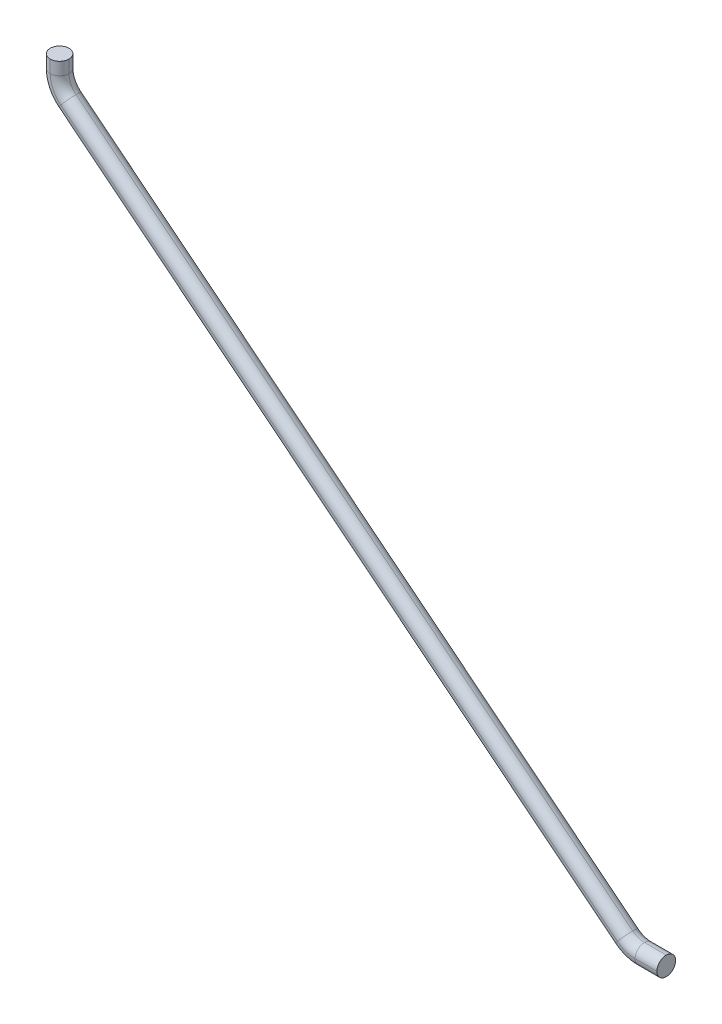
ISO-10303-21;
HEADER;
FILE_DESCRIPTION(('STEP AP214'),'2;1');
FILE_NAME('part.step','',(''),(''),'','','');
FILE_SCHEMA(('AUTOMOTIVE_DESIGN { 1 0 10303 214 1 1 1 1 }'));
ENDSEC;
DATA;
#1=APPLICATION_CONTEXT('core data for automotive mechanical design processes');
#2=APPLICATION_PROTOCOL_DEFINITION('international standard','automotive_design',2000,#1);
#3=PRODUCT_CONTEXT('',#1,'mechanical');
#4=PRODUCT('Part','Part','',(#3));
#5=PRODUCT_RELATED_PRODUCT_CATEGORY('part','',(#4));
#6=PRODUCT_DEFINITION_FORMATION('','',#4);
#7=PRODUCT_DEFINITION_CONTEXT('part definition',#1,'design');
#8=PRODUCT_DEFINITION('design','',#6,#7);
#9=PRODUCT_DEFINITION_SHAPE('','',#8);
#10=(LENGTH_UNIT() NAMED_UNIT(*) SI_UNIT(.MILLI.,.METRE.));
#11=(NAMED_UNIT(*) PLANE_ANGLE_UNIT() SI_UNIT($,.RADIAN.));
#12=(NAMED_UNIT(*) SI_UNIT($,.STERADIAN.) SOLID_ANGLE_UNIT());
#13=UNCERTAINTY_MEASURE_WITH_UNIT(LENGTH_MEASURE(1.E-05),#10,'distance_accuracy_value','');
#14=(GEOMETRIC_REPRESENTATION_CONTEXT(3) GLOBAL_UNCERTAINTY_ASSIGNED_CONTEXT((#13)) GLOBAL_UNIT_ASSIGNED_CONTEXT((#10,
#11,#12)) REPRESENTATION_CONTEXT('',''));
#15=CARTESIAN_POINT('',(0.,0.,0.));
#16=DIRECTION('',(0.,0.,1.));
#17=DIRECTION('',(1.,0.,0.));
#18=AXIS2_PLACEMENT_3D('',#15,#16,#17);
#19=CARTESIAN_POINT('',(-398.535967460034,-990.945694684209,-10.));
#20=DIRECTION('',(0.,1.,0.));
#21=DIRECTION('',(0.,0.,1.));
#22=AXIS2_PLACEMENT_3D('',#19,#20,#21);
#23=PLANE('',#22);
#24=CARTESIAN_POINT('',(-408.535967460034,-990.945694684209,0.));
#25=DIRECTION('',(0.,1.,0.));
#26=DIRECTION('',(0.,0.,1.));
#27=AXIS2_PLACEMENT_3D('',#24,#25,#26);
#28=CIRCLE('',#27,10.);
#29=CARTESIAN_POINT('',(-408.535967460034,-990.945694684209,10.));
#30=VERTEX_POINT('',#29);
#31=CARTESIAN_POINT('',(-398.535967460034,-990.945694684209,0.));
#32=VERTEX_POINT('',#31);
#33=EDGE_CURVE('E136',#30,#32,#28,.T.);
#34=ORIENTED_EDGE('',*,*,#33,.T.);
#35=CARTESIAN_POINT('',(-408.535967460034,-990.945694684209,0.));
#36=DIRECTION('',(0.,1.,0.));
#37=DIRECTION('',(0.,0.,1.));
#38=AXIS2_PLACEMENT_3D('',#35,#36,#37);
#39=CIRCLE('',#38,10.);
#40=CARTESIAN_POINT('',(-408.535967460034,-990.945694684209,-10.));
#41=VERTEX_POINT('',#40);
#42=EDGE_CURVE('E11',#32,#41,#39,.T.);
#43=ORIENTED_EDGE('',*,*,#42,.T.);
#44=CARTESIAN_POINT('',(-408.535967460034,-990.945694684209,0.));
#45=DIRECTION('',(0.,1.,0.));
#46=DIRECTION('',(0.,0.,1.));
#47=AXIS2_PLACEMENT_3D('',#44,#45,#46);
#48=CIRCLE('',#47,10.);
#49=CARTESIAN_POINT('',(-418.535967460034,-990.945694684209,0.));
#50=VERTEX_POINT('',#49);
#51=EDGE_CURVE('E44',#41,#50,#48,.T.);
#52=ORIENTED_EDGE('',*,*,#51,.T.);
#53=CARTESIAN_POINT('',(-408.535967460034,-990.945694684209,0.));
#54=DIRECTION('',(0.,1.,0.));
#55=DIRECTION('',(0.,0.,1.));
#56=AXIS2_PLACEMENT_3D('',#53,#54,#55);
#57=CIRCLE('',#56,10.);
#58=EDGE_CURVE('E135',#50,#30,#57,.T.);
#59=ORIENTED_EDGE('',*,*,#58,.T.);
#60=EDGE_LOOP('',(#34,#43,#52,#59));
#61=FACE_BOUND('',#60,.T.);
#62=ADVANCED_FACE('F34',(#61),#23,.T.);
#63=CARTESIAN_POINT('',(237.926881338432,-1499.57063721451,-10.));
#64=DIRECTION('',(1.,0.,0.));
#65=DIRECTION('',(0.,0.,-1.));
#66=AXIS2_PLACEMENT_3D('',#63,#64,#65);
#67=PLANE('',#66);
#68=CARTESIAN_POINT('',(237.926881338432,-1509.57063721451,0.));
#69=DIRECTION('',(1.,0.,0.));
#70=DIRECTION('',(0.,0.,-1.));
#71=AXIS2_PLACEMENT_3D('',#68,#69,#70);
#72=CIRCLE('',#71,10.);
#73=CARTESIAN_POINT('',(237.926881338432,-1519.57063721451,0.));
#74=VERTEX_POINT('',#73);
#75=CARTESIAN_POINT('',(237.926881338432,-1509.57063721451,-10.));
#76=VERTEX_POINT('',#75);
#77=EDGE_CURVE('E470',#74,#76,#72,.T.);
#78=ORIENTED_EDGE('',*,*,#77,.T.);
#79=CARTESIAN_POINT('',(237.926881338432,-1509.57063721451,0.));
#80=DIRECTION('',(1.,0.,0.));
#81=DIRECTION('',(0.,0.,-1.));
#82=AXIS2_PLACEMENT_3D('',#79,#80,#81);
#83=CIRCLE('',#82,10.);
#84=CARTESIAN_POINT('',(237.926881338432,-1499.57063721451,0.));
#85=VERTEX_POINT('',#84);
#86=EDGE_CURVE('E138',#76,#85,#83,.T.);
#87=ORIENTED_EDGE('',*,*,#86,.T.);
#88=CARTESIAN_POINT('',(237.926881338432,-1509.57063721451,0.));
#89=DIRECTION('',(1.,0.,0.));
#90=DIRECTION('',(0.,0.,-1.));
#91=AXIS2_PLACEMENT_3D('',#88,#89,#90);
#92=CIRCLE('',#91,10.);
#93=CARTESIAN_POINT('',(237.926881338432,-1509.57063721451,10.));
#94=VERTEX_POINT('',#93);
#95=EDGE_CURVE('E473',#85,#94,#92,.T.);
#96=ORIENTED_EDGE('',*,*,#95,.T.);
#97=CARTESIAN_POINT('',(237.926881338432,-1509.57063721451,0.));
#98=DIRECTION('',(1.,0.,0.));
#99=DIRECTION('',(0.,0.,-1.));
#100=AXIS2_PLACEMENT_3D('',#97,#98,#99);
#101=CIRCLE('',#100,10.);
#102=EDGE_CURVE('E142',#94,#74,#101,.T.);
#103=ORIENTED_EDGE('',*,*,#102,.T.);
#104=EDGE_LOOP('',(#78,#87,#96,#103));
#105=FACE_BOUND('',#104,.T.);
#106=ADVANCED_FACE('F271',(#105),#67,.T.);
#107=CARTESIAN_POINT('',(-408.535967460034,-1004.3738482205,0.));
#108=DIRECTION('',(0.,1.,0.));
#109=DIRECTION('',(0.,0.,1.));
#110=AXIS2_PLACEMENT_3D('',#107,#108,#109);
#111=CYLINDRICAL_SURFACE('',#110,10.);
#112=DIRECTION('',(0.,-1.,0.));
#113=VECTOR('',#112,1.);
#114=CARTESIAN_POINT('',(-408.535967460034,-1004.3738482205,10.));
#115=LINE('',#114,#113);
#116=CARTESIAN_POINT('',(-408.535967460034,-1004.3738482205,10.));
#117=VERTEX_POINT('',#116);
#118=EDGE_CURVE('E38',#30,#117,#115,.T.);
#119=ORIENTED_EDGE('',*,*,#118,.F.);
#120=ORIENTED_EDGE('',*,*,#58,.F.);
#121=DIRECTION('',(0.,-1.,0.));
#122=VECTOR('',#121,1.);
#123=CARTESIAN_POINT('',(-418.535967460034,-990.945694684209,0.));
#124=LINE('',#123,#122);
#125=CARTESIAN_POINT('',(-418.535967460034,-1004.3738482205,0.));
#126=VERTEX_POINT('',#125);
#127=EDGE_CURVE('E106',#126,#50,#124,.F.);
#128=ORIENTED_EDGE('',*,*,#127,.F.);
#129=CARTESIAN_POINT('',(-408.535967460034,-1004.3738482205,0.));
#130=DIRECTION('',(0.,-1.,0.));
#131=DIRECTION('',(0.,0.,-1.));
#132=AXIS2_PLACEMENT_3D('',#129,#130,#131);
#133=CIRCLE('',#132,10.);
#134=EDGE_CURVE('E140',#117,#126,#133,.T.);
#135=ORIENTED_EDGE('',*,*,#134,.F.);
#136=EDGE_LOOP('',(#119,#120,#128,#135));
#137=FACE_BOUND('',#136,.T.);
#138=ADVANCED_FACE('F36',(#137),#111,.T.);
#139=CARTESIAN_POINT('',(-408.535967460034,-1004.3738482205,0.));
#140=DIRECTION('',(0.,-1.,0.));
#141=DIRECTION('',(0.,0.,-1.));
#142=AXIS2_PLACEMENT_3D('',#139,#140,#141);
#143=CYLINDRICAL_SURFACE('',#142,10.);
#144=ORIENTED_EDGE('',*,*,#33,.F.);
#145=ORIENTED_EDGE('',*,*,#118,.T.);
#146=CARTESIAN_POINT('',(-408.535967460034,-1004.3738482205,0.));
#147=DIRECTION('',(0.,-1.,0.));
#148=DIRECTION('',(0.,0.,-1.));
#149=AXIS2_PLACEMENT_3D('',#146,#147,#148);
#150=CIRCLE('',#149,10.);
#151=CARTESIAN_POINT('',(-398.535967460034,-1004.3738482205,0.));
#152=VERTEX_POINT('',#151);
#153=EDGE_CURVE('E233',#152,#117,#150,.T.);
#154=ORIENTED_EDGE('',*,*,#153,.F.);
#155=DIRECTION('',(0.,1.,0.));
#156=VECTOR('',#155,1.);
#157=CARTESIAN_POINT('',(-398.535967460034,-1004.3738482205,0.));
#158=LINE('',#157,#156);
#159=EDGE_CURVE('E145',#32,#152,#158,.F.);
#160=ORIENTED_EDGE('',*,*,#159,.F.);
#161=EDGE_LOOP('',(#144,#145,#154,#160));
#162=FACE_BOUND('',#161,.T.);
#163=ADVANCED_FACE('F143',(#162),#143,.T.);
#164=CARTESIAN_POINT('',(-408.535967460034,-990.945694684209,0.));
#165=DIRECTION('',(0.,-1.,0.));
#166=DIRECTION('',(0.,0.,-1.));
#167=AXIS2_PLACEMENT_3D('',#164,#165,#166);
#168=CYLINDRICAL_SURFACE('',#167,10.);
#169=ORIENTED_EDGE('',*,*,#127,.T.);
#170=ORIENTED_EDGE('',*,*,#51,.F.);
#171=DIRECTION('',(0.,-1.,0.));
#172=VECTOR('',#171,1.);
#173=CARTESIAN_POINT('',(-408.535967460034,-1004.3738482205,-10.));
#174=LINE('',#173,#172);
#175=CARTESIAN_POINT('',(-408.535967460034,-1004.3738482205,-10.));
#176=VERTEX_POINT('',#175);
#177=EDGE_CURVE('E53',#176,#41,#174,.F.);
#178=ORIENTED_EDGE('',*,*,#177,.F.);
#179=CARTESIAN_POINT('',(-408.535967460034,-1004.3738482205,0.));
#180=DIRECTION('',(0.,-1.,0.));
#181=DIRECTION('',(0.,0.,-1.));
#182=AXIS2_PLACEMENT_3D('',#179,#180,#181);
#183=CIRCLE('',#182,10.);
#184=EDGE_CURVE('E228',#126,#176,#183,.T.);
#185=ORIENTED_EDGE('',*,*,#184,.F.);
#186=EDGE_LOOP('',(#169,#170,#178,#185));
#187=FACE_BOUND('',#186,.T.);
#188=ADVANCED_FACE('F240',(#187),#168,.T.);
#189=CARTESIAN_POINT('',(-378.535967460034,-1004.3738482205,0.));
#190=DIRECTION('',(0.,0.,-1.));
#191=DIRECTION('',(-1.,0.,0.));
#192=AXIS2_PLACEMENT_3D('',#189,#190,#191);
#193=TOROIDAL_SURFACE('',#192,30.0000000000001,10.);
#194=CARTESIAN_POINT('',(-378.535967460034,-1004.3738482205,10.));
#195=DIRECTION('',(0.,0.,-1.));
#196=DIRECTION('',(-1.,0.,0.));
#197=AXIS2_PLACEMENT_3D('',#194,#195,#196);
#198=CIRCLE('',#197,30.0000000000001);
#199=CARTESIAN_POINT('',(-397.290955483856,-1027.78859622739,10.));
#200=VERTEX_POINT('',#199);
#201=EDGE_CURVE('E236',#117,#200,#198,.F.);
#202=ORIENTED_EDGE('',*,*,#201,.F.);
#203=ORIENTED_EDGE('',*,*,#134,.T.);
#204=CARTESIAN_POINT('',(-378.535967460034,-1004.3738482205,0.));
#205=DIRECTION('',(0.,0.,-1.));
#206=DIRECTION('',(-1.,0.,0.));
#207=AXIS2_PLACEMENT_3D('',#204,#205,#206);
#208=CIRCLE('',#207,40.0000000000001);
#209=CARTESIAN_POINT('',(-403.542618158463,-1035.59351222969,0.));
#210=VERTEX_POINT('',#209);
#211=EDGE_CURVE('E225',#210,#126,#208,.T.);
#212=ORIENTED_EDGE('',*,*,#211,.F.);
#213=CARTESIAN_POINT('',(-397.290955483856,-1027.78859622739,0.));
#214=DIRECTION('',(0.780491600229767,-0.625166267460727,0.));
#215=DIRECTION('',(0.625166267460727,0.780491600229767,0.));
#216=AXIS2_PLACEMENT_3D('',#213,#214,#215);
#217=CIRCLE('',#216,10.);
#218=EDGE_CURVE('E222',#200,#210,#217,.T.);
#219=ORIENTED_EDGE('',*,*,#218,.F.);
#220=EDGE_LOOP('',(#202,#203,#212,#219));
#221=FACE_BOUND('',#220,.T.);
#222=ADVANCED_FACE('F246',(#221),#193,.T.);
#223=CARTESIAN_POINT('',(-378.535967460034,-1004.3738482205,0.));
#224=DIRECTION('',(0.,0.,-1.));
#225=DIRECTION('',(-1.,0.,0.));
#226=AXIS2_PLACEMENT_3D('',#223,#224,#225);
#227=TOROIDAL_SURFACE('',#226,30.,10.);
#228=ORIENTED_EDGE('',*,*,#153,.T.);
#229=ORIENTED_EDGE('',*,*,#201,.T.);
#230=CARTESIAN_POINT('',(-397.290955483856,-1027.78859622739,0.));
#231=DIRECTION('',(0.780491600229764,-0.625166267460731,0.));
#232=DIRECTION('',(0.625166267460731,0.780491600229764,0.));
#233=AXIS2_PLACEMENT_3D('',#230,#231,#232);
#234=CIRCLE('',#233,10.);
#235=CARTESIAN_POINT('',(-391.039292809248,-1019.98368022509,0.));
#236=VERTEX_POINT('',#235);
#237=EDGE_CURVE('E217',#236,#200,#234,.T.);
#238=ORIENTED_EDGE('',*,*,#237,.F.);
#239=CARTESIAN_POINT('',(-378.535967460034,-1004.3738482205,0.));
#240=DIRECTION('',(0.,0.,-1.));
#241=DIRECTION('',(-1.,0.,0.));
#242=AXIS2_PLACEMENT_3D('',#239,#240,#241);
#243=CIRCLE('',#242,20.);
#244=EDGE_CURVE('E214',#152,#236,#243,.F.);
#245=ORIENTED_EDGE('',*,*,#244,.F.);
#246=EDGE_LOOP('',(#228,#229,#238,#245));
#247=FACE_BOUND('',#246,.T.);
#248=ADVANCED_FACE('F257',(#247),#227,.T.);
#249=CARTESIAN_POINT('',(-408.535967460034,-990.945694684209,0.));
#250=DIRECTION('',(0.,1.,0.));
#251=DIRECTION('',(0.,0.,1.));
#252=AXIS2_PLACEMENT_3D('',#249,#250,#251);
#253=CYLINDRICAL_SURFACE('',#252,10.);
#254=ORIENTED_EDGE('',*,*,#42,.F.);
#255=ORIENTED_EDGE('',*,*,#159,.T.);
#256=CARTESIAN_POINT('',(-408.535967460034,-1004.3738482205,0.));
#257=DIRECTION('',(0.,-1.,0.));
#258=DIRECTION('',(0.,0.,-1.));
#259=AXIS2_PLACEMENT_3D('',#256,#257,#258);
#260=CIRCLE('',#259,10.);
#261=EDGE_CURVE('E211',#176,#152,#260,.T.);
#262=ORIENTED_EDGE('',*,*,#261,.F.);
#263=ORIENTED_EDGE('',*,*,#177,.T.);
#264=EDGE_LOOP('',(#254,#255,#262,#263));
#265=FACE_BOUND('',#264,.T.);
#266=ADVANCED_FACE('F261',(#265),#253,.T.);
#267=CARTESIAN_POINT('',(-378.535967460034,-1004.3738482205,0.));
#268=DIRECTION('',(0.,0.,-1.));
#269=DIRECTION('',(-1.,0.,0.));
#270=AXIS2_PLACEMENT_3D('',#267,#268,#269);
#271=TOROIDAL_SURFACE('',#270,30.0000000000001,10.);
#272=ORIENTED_EDGE('',*,*,#211,.T.);
#273=ORIENTED_EDGE('',*,*,#184,.T.);
#274=CARTESIAN_POINT('',(-378.535967460034,-1004.3738482205,-10.));
#275=DIRECTION('',(0.,0.,-1.));
#276=DIRECTION('',(-1.,0.,0.));
#277=AXIS2_PLACEMENT_3D('',#274,#275,#276);
#278=CIRCLE('',#277,30.0000000000001);
#279=CARTESIAN_POINT('',(-397.290955483856,-1027.78859622739,-10.));
#280=VERTEX_POINT('',#279);
#281=EDGE_CURVE('E208',#280,#176,#278,.T.);
#282=ORIENTED_EDGE('',*,*,#281,.F.);
#283=CARTESIAN_POINT('',(-397.290955483856,-1027.78859622739,0.));
#284=DIRECTION('',(0.780491600229767,-0.625166267460727,0.));
#285=DIRECTION('',(0.625166267460727,0.780491600229767,0.));
#286=AXIS2_PLACEMENT_3D('',#283,#284,#285);
#287=CIRCLE('',#286,10.);
#288=EDGE_CURVE('E205',#210,#280,#287,.T.);
#289=ORIENTED_EDGE('',*,*,#288,.F.);
#290=EDGE_LOOP('',(#272,#273,#282,#289));
#291=FACE_BOUND('',#290,.T.);
#292=ADVANCED_FACE('F243',(#291),#271,.T.);
#293=CARTESIAN_POINT('',(-397.290955483856,-1027.78859622739,0.));
#294=DIRECTION('',(-0.780491600229761,0.625166267460735,0.));
#295=DIRECTION('',(-0.625166267460735,-0.780491600229761,0.));
#296=AXIS2_PLACEMENT_3D('',#293,#294,#295);
#297=CYLINDRICAL_SURFACE('',#296,10.);
#298=DIRECTION('',(0.780491600229761,-0.625166267460735,0.));
#299=VECTOR('',#298,1.);
#300=CARTESIAN_POINT('',(195.970583998156,-1502.9853852214,10.));
#301=LINE('',#300,#299);
#302=CARTESIAN_POINT('',(195.970583998156,-1502.9853852214,10.));
#303=VERTEX_POINT('',#302);
#304=EDGE_CURVE('E220',#200,#303,#301,.T.);
#305=ORIENTED_EDGE('',*,*,#304,.F.);
#306=ORIENTED_EDGE('',*,*,#218,.T.);
#307=DIRECTION('',(0.780491600229761,-0.625166267460735,0.));
#308=VECTOR('',#307,1.);
#309=CARTESIAN_POINT('',(-403.542618158463,-1035.59351222969,0.));
#310=LINE('',#309,#308);
#311=CARTESIAN_POINT('',(189.718921323549,-1510.7903012237,0.));
#312=VERTEX_POINT('',#311);
#313=EDGE_CURVE('E202',#312,#210,#310,.F.);
#314=ORIENTED_EDGE('',*,*,#313,.F.);
#315=CARTESIAN_POINT('',(195.970583998156,-1502.9853852214,0.));
#316=DIRECTION('',(0.780491600229752,-0.625166267460746,0.));
#317=DIRECTION('',(0.625166267460746,0.780491600229752,0.));
#318=AXIS2_PLACEMENT_3D('',#315,#316,#317);
#319=CIRCLE('',#318,10.);
#320=EDGE_CURVE('E199',#303,#312,#319,.T.);
#321=ORIENTED_EDGE('',*,*,#320,.F.);
#322=EDGE_LOOP('',(#305,#306,#314,#321));
#323=FACE_BOUND('',#322,.T.);
#324=ADVANCED_FACE('F249',(#323),#297,.T.);
#325=CARTESIAN_POINT('',(-397.290955483856,-1027.78859622739,0.));
#326=DIRECTION('',(0.780491600229761,-0.625166267460735,0.));
#327=DIRECTION('',(0.625166267460735,0.780491600229761,0.));
#328=AXIS2_PLACEMENT_3D('',#325,#326,#327);
#329=CYLINDRICAL_SURFACE('',#328,10.);
#330=ORIENTED_EDGE('',*,*,#237,.T.);
#331=ORIENTED_EDGE('',*,*,#304,.T.);
#332=CARTESIAN_POINT('',(195.970583998156,-1502.9853852214,0.));
#333=DIRECTION('',(0.780491600229764,-0.625166267460731,0.));
#334=DIRECTION('',(0.625166267460731,0.780491600229764,0.));
#335=AXIS2_PLACEMENT_3D('',#332,#333,#334);
#336=CIRCLE('',#335,10.);
#337=CARTESIAN_POINT('',(202.222246672763,-1495.1804692191,0.));
#338=VERTEX_POINT('',#337);
#339=EDGE_CURVE('E191',#338,#303,#336,.T.);
#340=ORIENTED_EDGE('',*,*,#339,.F.);
#341=DIRECTION('',(-0.780491600229761,0.625166267460735,0.));
#342=VECTOR('',#341,1.);
#343=CARTESIAN_POINT('',(202.222246672763,-1495.1804692191,0.));
#344=LINE('',#343,#342);
#345=EDGE_CURVE('E188',#236,#338,#344,.F.);
#346=ORIENTED_EDGE('',*,*,#345,.F.);
#347=EDGE_LOOP('',(#330,#331,#340,#346));
#348=FACE_BOUND('',#347,.T.);
#349=ADVANCED_FACE('F254',(#348),#329,.T.);
#350=CARTESIAN_POINT('',(-378.535967460034,-1004.3738482205,0.));
#351=DIRECTION('',(0.,0.,-1.));
#352=DIRECTION('',(-1.,0.,0.));
#353=AXIS2_PLACEMENT_3D('',#350,#351,#352);
#354=TOROIDAL_SURFACE('',#353,30.,10.);
#355=ORIENTED_EDGE('',*,*,#261,.T.);
#356=ORIENTED_EDGE('',*,*,#244,.T.);
#357=CARTESIAN_POINT('',(-397.290955483856,-1027.78859622739,0.));
#358=DIRECTION('',(0.780491600229767,-0.625166267460727,0.));
#359=DIRECTION('',(0.625166267460727,0.780491600229767,0.));
#360=AXIS2_PLACEMENT_3D('',#357,#358,#359);
#361=CIRCLE('',#360,10.);
#362=EDGE_CURVE('E185',#280,#236,#361,.T.);
#363=ORIENTED_EDGE('',*,*,#362,.F.);
#364=ORIENTED_EDGE('',*,*,#281,.T.);
#365=EDGE_LOOP('',(#355,#356,#363,#364));
#366=FACE_BOUND('',#365,.T.);
#367=ADVANCED_FACE('F260',(#366),#354,.T.);
#368=CARTESIAN_POINT('',(-397.290955483856,-1027.78859622739,0.));
#369=DIRECTION('',(0.780491600229761,-0.625166267460735,0.));
#370=DIRECTION('',(0.625166267460735,0.780491600229761,0.));
#371=AXIS2_PLACEMENT_3D('',#368,#369,#370);
#372=CYLINDRICAL_SURFACE('',#371,10.);
#373=ORIENTED_EDGE('',*,*,#313,.T.);
#374=ORIENTED_EDGE('',*,*,#288,.T.);
#375=DIRECTION('',(0.780491600229761,-0.625166267460735,0.));
#376=VECTOR('',#375,1.);
#377=CARTESIAN_POINT('',(-397.290955483856,-1027.78859622739,-10.));
#378=LINE('',#377,#376);
#379=CARTESIAN_POINT('',(195.970583998156,-1502.9853852214,-10.));
#380=VERTEX_POINT('',#379);
#381=EDGE_CURVE('E182',#380,#280,#378,.F.);
#382=ORIENTED_EDGE('',*,*,#381,.F.);
#383=CARTESIAN_POINT('',(195.970583998156,-1502.9853852214,0.));
#384=DIRECTION('',(0.780491600229764,-0.625166267460731,0.));
#385=DIRECTION('',(0.625166267460731,0.780491600229764,0.));
#386=AXIS2_PLACEMENT_3D('',#383,#384,#385);
#387=CIRCLE('',#386,10.);
#388=EDGE_CURVE('E179',#312,#380,#387,.T.);
#389=ORIENTED_EDGE('',*,*,#388,.F.);
#390=EDGE_LOOP('',(#373,#374,#382,#389));
#391=FACE_BOUND('',#390,.T.);
#392=ADVANCED_FACE('F313',(#391),#372,.T.);
#393=CARTESIAN_POINT('',(214.725572021978,-1479.57063721451,0.));
#394=DIRECTION('',(0.,0.,-1.));
#395=DIRECTION('',(-1.,0.,0.));
#396=AXIS2_PLACEMENT_3D('',#393,#394,#395);
#397=TOROIDAL_SURFACE('',#396,30.,10.);
#398=CARTESIAN_POINT('',(214.725572021978,-1509.57063721451,0.));
#399=DIRECTION('',(1.,0.,0.));
#400=DIRECTION('',(0.,0.,-1.));
#401=AXIS2_PLACEMENT_3D('',#398,#399,#400);
#402=CIRCLE('',#401,10.);
#403=CARTESIAN_POINT('',(214.725572021978,-1509.57063721451,10.));
#404=VERTEX_POINT('',#403);
#405=CARTESIAN_POINT('',(214.725572021978,-1519.57063721451,0.));
#406=VERTEX_POINT('',#405);
#407=EDGE_CURVE('E197',#404,#406,#402,.T.);
#408=ORIENTED_EDGE('',*,*,#407,.F.);
#409=CARTESIAN_POINT('',(214.725572021978,-1479.57063721451,10.));
#410=DIRECTION('',(0.,0.,-1.));
#411=DIRECTION('',(-1.,0.,0.));
#412=AXIS2_PLACEMENT_3D('',#409,#410,#411);
#413=CIRCLE('',#412,30.);
#414=EDGE_CURVE('E194',#303,#404,#413,.F.);
#415=ORIENTED_EDGE('',*,*,#414,.F.);
#416=ORIENTED_EDGE('',*,*,#320,.T.);
#417=CARTESIAN_POINT('',(214.725572021978,-1479.57063721451,0.));
#418=DIRECTION('',(0.,0.,-1.));
#419=DIRECTION('',(-1.,0.,0.));
#420=AXIS2_PLACEMENT_3D('',#417,#418,#419);
#421=CIRCLE('',#420,40.);
#422=EDGE_CURVE('E176',#406,#312,#421,.T.);
#423=ORIENTED_EDGE('',*,*,#422,.F.);
#424=EDGE_LOOP('',(#408,#415,#416,#423));
#425=FACE_BOUND('',#424,.T.);
#426=ADVANCED_FACE('F309',(#425),#397,.T.);
#427=CARTESIAN_POINT('',(-378.535967460034,-1509.57063721451,0.));
#428=DIRECTION('',(-1.,0.,0.));
#429=DIRECTION('',(0.,0.,1.));
#430=AXIS2_PLACEMENT_3D('',#427,#428,#429);
#431=CYLINDRICAL_SURFACE('',#430,10.);
#432=DIRECTION('',(1.,0.,0.));
#433=VECTOR('',#432,1.);
#434=CARTESIAN_POINT('',(237.926881338432,-1509.57063721451,10.));
#435=LINE('',#434,#433);
#436=EDGE_CURVE('E168',#404,#94,#435,.T.);
#437=ORIENTED_EDGE('',*,*,#436,.F.);
#438=ORIENTED_EDGE('',*,*,#407,.T.);
#439=DIRECTION('',(1.,0.,0.));
#440=VECTOR('',#439,1.);
#441=CARTESIAN_POINT('',(214.725572021978,-1519.57063721451,0.));
#442=LINE('',#441,#440);
#443=EDGE_CURVE('E171',#74,#406,#442,.F.);
#444=ORIENTED_EDGE('',*,*,#443,.F.);
#445=ORIENTED_EDGE('',*,*,#102,.F.);
#446=EDGE_LOOP('',(#437,#438,#444,#445));
#447=FACE_BOUND('',#446,.T.);
#448=ADVANCED_FACE('F305',(#447),#431,.T.);
#449=CARTESIAN_POINT('',(214.725572021978,-1479.57063721451,0.));
#450=DIRECTION('',(0.,0.,-1.));
#451=DIRECTION('',(-1.,0.,0.));
#452=AXIS2_PLACEMENT_3D('',#449,#450,#451);
#453=TOROIDAL_SURFACE('',#452,29.9999999999999,10.);
#454=ORIENTED_EDGE('',*,*,#339,.T.);
#455=ORIENTED_EDGE('',*,*,#414,.T.);
#456=CARTESIAN_POINT('',(214.725572021978,-1509.57063721451,0.));
#457=DIRECTION('',(1.,0.,0.));
#458=DIRECTION('',(0.,0.,-1.));
#459=AXIS2_PLACEMENT_3D('',#456,#457,#458);
#460=CIRCLE('',#459,10.);
#461=CARTESIAN_POINT('',(214.725572021978,-1499.57063721451,0.));
#462=VERTEX_POINT('',#461);
#463=EDGE_CURVE('E165',#462,#404,#460,.T.);
#464=ORIENTED_EDGE('',*,*,#463,.F.);
#465=CARTESIAN_POINT('',(214.725572021978,-1479.57063721451,0.));
#466=DIRECTION('',(0.,0.,-1.));
#467=DIRECTION('',(-1.,0.,0.));
#468=AXIS2_PLACEMENT_3D('',#465,#466,#467);
#469=CIRCLE('',#468,19.9999999999999);
#470=EDGE_CURVE('E162',#338,#462,#469,.F.);
#471=ORIENTED_EDGE('',*,*,#470,.F.);
#472=EDGE_LOOP('',(#454,#455,#464,#471));
#473=FACE_BOUND('',#472,.T.);
#474=ADVANCED_FACE('F301',(#473),#453,.T.);
#475=CARTESIAN_POINT('',(-397.290955483856,-1027.78859622739,0.));
#476=DIRECTION('',(-0.780491600229761,0.625166267460735,0.));
#477=DIRECTION('',(-0.625166267460735,-0.780491600229761,0.));
#478=AXIS2_PLACEMENT_3D('',#475,#476,#477);
#479=CYLINDRICAL_SURFACE('',#478,10.);
#480=ORIENTED_EDGE('',*,*,#362,.T.);
#481=ORIENTED_EDGE('',*,*,#345,.T.);
#482=CARTESIAN_POINT('',(195.970583998156,-1502.9853852214,0.));
#483=DIRECTION('',(0.780491600229756,-0.625166267460741,0.));
#484=DIRECTION('',(0.625166267460741,0.780491600229756,0.));
#485=AXIS2_PLACEMENT_3D('',#482,#483,#484);
#486=CIRCLE('',#485,10.);
#487=EDGE_CURVE('E159',#380,#338,#486,.T.);
#488=ORIENTED_EDGE('',*,*,#487,.F.);
#489=ORIENTED_EDGE('',*,*,#381,.T.);
#490=EDGE_LOOP('',(#480,#481,#488,#489));
#491=FACE_BOUND('',#490,.T.);
#492=ADVANCED_FACE('F297',(#491),#479,.T.);
#493=CARTESIAN_POINT('',(214.725572021978,-1479.57063721451,0.));
#494=DIRECTION('',(0.,0.,-1.));
#495=DIRECTION('',(-1.,0.,0.));
#496=AXIS2_PLACEMENT_3D('',#493,#494,#495);
#497=TOROIDAL_SURFACE('',#496,30.,10.);
#498=CARTESIAN_POINT('',(214.725572021978,-1509.57063721451,0.));
#499=DIRECTION('',(1.,0.,0.));
#500=DIRECTION('',(0.,0.,-1.));
#501=AXIS2_PLACEMENT_3D('',#498,#499,#500);
#502=CIRCLE('',#501,10.);
#503=CARTESIAN_POINT('',(214.725572021978,-1509.57063721451,-10.));
#504=VERTEX_POINT('',#503);
#505=EDGE_CURVE('E174',#406,#504,#502,.T.);
#506=ORIENTED_EDGE('',*,*,#505,.F.);
#507=ORIENTED_EDGE('',*,*,#422,.T.);
#508=ORIENTED_EDGE('',*,*,#388,.T.);
#509=CARTESIAN_POINT('',(214.725572021978,-1479.57063721451,-10.));
#510=DIRECTION('',(0.,0.,-1.));
#511=DIRECTION('',(-1.,0.,0.));
#512=AXIS2_PLACEMENT_3D('',#509,#510,#511);
#513=CIRCLE('',#512,30.);
#514=EDGE_CURVE('E156',#504,#380,#513,.T.);
#515=ORIENTED_EDGE('',*,*,#514,.F.);
#516=EDGE_LOOP('',(#506,#507,#508,#515));
#517=FACE_BOUND('',#516,.T.);
#518=ADVANCED_FACE('F293',(#517),#497,.T.);
#519=CARTESIAN_POINT('',(214.725572021978,-1509.57063721451,0.));
#520=DIRECTION('',(1.,0.,0.));
#521=DIRECTION('',(0.,0.,-1.));
#522=AXIS2_PLACEMENT_3D('',#519,#520,#521);
#523=CYLINDRICAL_SURFACE('',#522,10.);
#524=ORIENTED_EDGE('',*,*,#443,.T.);
#525=ORIENTED_EDGE('',*,*,#505,.T.);
#526=DIRECTION('',(1.,0.,0.));
#527=VECTOR('',#526,1.);
#528=CARTESIAN_POINT('',(-378.535967460034,-1509.57063721451,-10.));
#529=LINE('',#528,#527);
#530=EDGE_CURVE('E153',#76,#504,#529,.F.);
#531=ORIENTED_EDGE('',*,*,#530,.F.);
#532=ORIENTED_EDGE('',*,*,#77,.F.);
#533=EDGE_LOOP('',(#524,#525,#531,#532));
#534=FACE_BOUND('',#533,.T.);
#535=ADVANCED_FACE('F289',(#534),#523,.T.);
#536=CARTESIAN_POINT('',(-378.535967460034,-1509.57063721451,0.));
#537=DIRECTION('',(1.,0.,0.));
#538=DIRECTION('',(0.,0.,-1.));
#539=AXIS2_PLACEMENT_3D('',#536,#537,#538);
#540=CYLINDRICAL_SURFACE('',#539,10.);
#541=ORIENTED_EDGE('',*,*,#436,.T.);
#542=ORIENTED_EDGE('',*,*,#95,.F.);
#543=DIRECTION('',(-1.,0.,0.));
#544=VECTOR('',#543,1.);
#545=CARTESIAN_POINT('',(237.926881338432,-1499.57063721451,0.));
#546=LINE('',#545,#544);
#547=EDGE_CURVE('E120',#462,#85,#546,.F.);
#548=ORIENTED_EDGE('',*,*,#547,.F.);
#549=ORIENTED_EDGE('',*,*,#463,.T.);
#550=EDGE_LOOP('',(#541,#542,#548,#549));
#551=FACE_BOUND('',#550,.T.);
#552=ADVANCED_FACE('F285',(#551),#540,.T.);
#553=CARTESIAN_POINT('',(214.725572021978,-1479.57063721451,0.));
#554=DIRECTION('',(0.,0.,-1.));
#555=DIRECTION('',(-1.,0.,0.));
#556=AXIS2_PLACEMENT_3D('',#553,#554,#555);
#557=TOROIDAL_SURFACE('',#556,29.9999999999999,10.);
#558=ORIENTED_EDGE('',*,*,#487,.T.);
#559=ORIENTED_EDGE('',*,*,#470,.T.);
#560=CARTESIAN_POINT('',(214.725572021978,-1509.57063721451,0.));
#561=DIRECTION('',(1.,0.,0.));
#562=DIRECTION('',(0.,0.,-1.));
#563=AXIS2_PLACEMENT_3D('',#560,#561,#562);
#564=CIRCLE('',#563,10.);
#565=EDGE_CURVE('E150',#504,#462,#564,.T.);
#566=ORIENTED_EDGE('',*,*,#565,.F.);
#567=ORIENTED_EDGE('',*,*,#514,.T.);
#568=EDGE_LOOP('',(#558,#559,#566,#567));
#569=FACE_BOUND('',#568,.T.);
#570=ADVANCED_FACE('F282',(#569),#557,.T.);
#571=CARTESIAN_POINT('',(214.725572021978,-1509.57063721451,0.));
#572=DIRECTION('',(-1.,0.,0.));
#573=DIRECTION('',(0.,0.,1.));
#574=AXIS2_PLACEMENT_3D('',#571,#572,#573);
#575=CYLINDRICAL_SURFACE('',#574,10.);
#576=ORIENTED_EDGE('',*,*,#86,.F.);
#577=ORIENTED_EDGE('',*,*,#530,.T.);
#578=ORIENTED_EDGE('',*,*,#565,.T.);
#579=ORIENTED_EDGE('',*,*,#547,.T.);
#580=EDGE_LOOP('',(#576,#577,#578,#579));
#581=FACE_BOUND('',#580,.T.);
#582=ADVANCED_FACE('F279',(#581),#575,.T.);
#583=CLOSED_SHELL('',(#62,#106,#138,#163,#188,#222,#248,#266,#292,#324,#349,#367,#392,#426,#448,
#474,#492,#518,#535,#552,#570,#582));
#584=MANIFOLD_SOLID_BREP('B2',#583);
#585=ADVANCED_BREP_SHAPE_REPRESENTATION('',(#18,#584),#14);
#586=SHAPE_DEFINITION_REPRESENTATION(#9,#585);
ENDSEC;
END-ISO-10303-21;
